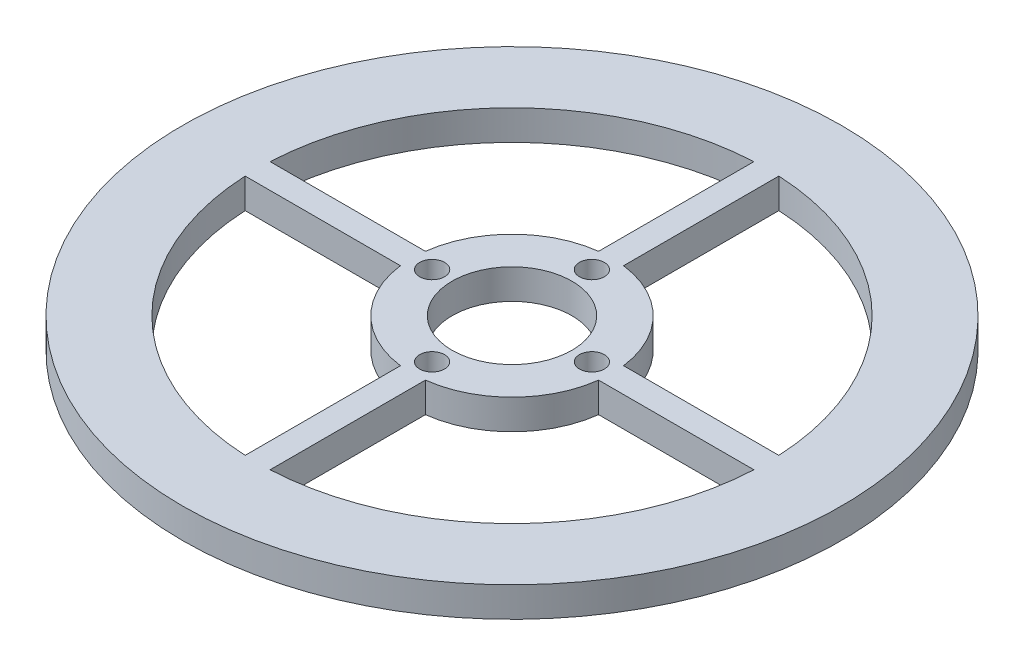
ISO-10303-21;
HEADER;
FILE_DESCRIPTION(('STEP AP214'),'2;1');
FILE_NAME('part.step','',(''),(''),'','','');
FILE_SCHEMA(('AUTOMOTIVE_DESIGN { 1 0 10303 214 1 1 1 1 }'));
ENDSEC;
DATA;
#1=APPLICATION_CONTEXT('core data for automotive mechanical design processes');
#2=APPLICATION_PROTOCOL_DEFINITION('international standard','automotive_design',2000,#1);
#3=PRODUCT_CONTEXT('',#1,'mechanical');
#4=PRODUCT('Part','Part','',(#3));
#5=PRODUCT_RELATED_PRODUCT_CATEGORY('part','',(#4));
#6=PRODUCT_DEFINITION_FORMATION('','',#4);
#7=PRODUCT_DEFINITION_CONTEXT('part definition',#1,'design');
#8=PRODUCT_DEFINITION('design','',#6,#7);
#9=PRODUCT_DEFINITION_SHAPE('','',#8);
#10=(LENGTH_UNIT() NAMED_UNIT(*) SI_UNIT(.MILLI.,.METRE.));
#11=(NAMED_UNIT(*) PLANE_ANGLE_UNIT() SI_UNIT($,.RADIAN.));
#12=(NAMED_UNIT(*) SI_UNIT($,.STERADIAN.) SOLID_ANGLE_UNIT());
#13=UNCERTAINTY_MEASURE_WITH_UNIT(LENGTH_MEASURE(1.E-05),#10,'distance_accuracy_value','');
#14=(GEOMETRIC_REPRESENTATION_CONTEXT(3) GLOBAL_UNCERTAINTY_ASSIGNED_CONTEXT((#13)) GLOBAL_UNIT_ASSIGNED_CONTEXT((#10,
#11,#12)) REPRESENTATION_CONTEXT('',''));
#15=CARTESIAN_POINT('',(0.,0.,0.));
#16=DIRECTION('',(0.,0.,1.));
#17=DIRECTION('',(1.,0.,0.));
#18=AXIS2_PLACEMENT_3D('',#15,#16,#17);
#19=CARTESIAN_POINT('',(-1.25,3.,0.));
#20=DIRECTION('',(1.,0.,0.));
#21=DIRECTION('',(0.,0.,-1.));
#22=AXIS2_PLACEMENT_3D('',#19,#20,#21);
#23=PLANE('',#22);
#24=DIRECTION('',(0.,0.,1.));
#25=VECTOR('',#24,1.);
#26=CARTESIAN_POINT('',(-1.25,0.,0.));
#27=LINE('',#26,#25);
#28=CARTESIAN_POINT('',(-1.25,0.,9.92156741649221));
#29=VERTEX_POINT('',#28);
#30=CARTESIAN_POINT('',(-1.25,0.,25.4693443182191));
#31=VERTEX_POINT('',#30);
#32=EDGE_CURVE('E259',#29,#31,#27,.T.);
#33=ORIENTED_EDGE('',*,*,#32,.T.);
#34=DIRECTION('',(0.,-1.,0.));
#35=VECTOR('',#34,1.);
#36=CARTESIAN_POINT('',(-1.25,3.,25.4693443182191));
#37=LINE('',#36,#35);
#38=CARTESIAN_POINT('',(-1.25,3.,25.4693443182191));
#39=VERTEX_POINT('',#38);
#40=EDGE_CURVE('E11',#39,#31,#37,.T.);
#41=ORIENTED_EDGE('',*,*,#40,.F.);
#42=DIRECTION('',(0.,0.,1.));
#43=VECTOR('',#42,1.);
#44=CARTESIAN_POINT('',(-1.25,3.,0.));
#45=LINE('',#44,#43);
#46=CARTESIAN_POINT('',(-1.25,3.,9.92156741649221));
#47=VERTEX_POINT('',#46);
#48=EDGE_CURVE('E181',#47,#39,#45,.T.);
#49=ORIENTED_EDGE('',*,*,#48,.F.);
#50=DIRECTION('',(0.,-1.,0.));
#51=VECTOR('',#50,1.);
#52=CARTESIAN_POINT('',(-1.25,3.,9.92156741649221));
#53=LINE('',#52,#51);
#54=EDGE_CURVE('E286',#47,#29,#53,.T.);
#55=ORIENTED_EDGE('',*,*,#54,.T.);
#56=EDGE_LOOP('',(#33,#41,#49,#55));
#57=FACE_BOUND('',#56,.T.);
#58=ADVANCED_FACE('F50',(#57),#23,.F.);
#59=CARTESIAN_POINT('',(0.,3.,0.));
#60=DIRECTION('',(0.,-1.,0.));
#61=DIRECTION('',(0.,0.,-1.));
#62=AXIS2_PLACEMENT_3D('',#59,#60,#61);
#63=CYLINDRICAL_SURFACE('',#62,25.5);
#64=CARTESIAN_POINT('',(0.,0.,0.));
#65=DIRECTION('',(0.,1.,0.));
#66=DIRECTION('',(0.,0.,1.));
#67=AXIS2_PLACEMENT_3D('',#64,#65,#66);
#68=CIRCLE('',#67,25.5);
#69=CARTESIAN_POINT('',(-25.4693443182191,0.,1.25));
#70=VERTEX_POINT('',#69);
#71=EDGE_CURVE('E171',#70,#31,#68,.T.);
#72=ORIENTED_EDGE('',*,*,#71,.F.);
#73=DIRECTION('',(0.,-1.,0.));
#74=VECTOR('',#73,1.);
#75=CARTESIAN_POINT('',(-25.4693443182191,3.,1.25));
#76=LINE('',#75,#74);
#77=CARTESIAN_POINT('',(-25.4693443182191,3.,1.25));
#78=VERTEX_POINT('',#77);
#79=EDGE_CURVE('E59',#78,#70,#76,.T.);
#80=ORIENTED_EDGE('',*,*,#79,.F.);
#81=CARTESIAN_POINT('',(0.,3.,0.));
#82=DIRECTION('',(0.,1.,0.));
#83=DIRECTION('',(0.,0.,1.));
#84=AXIS2_PLACEMENT_3D('',#81,#82,#83);
#85=CIRCLE('',#84,25.5);
#86=EDGE_CURVE('E168',#78,#39,#85,.T.);
#87=ORIENTED_EDGE('',*,*,#86,.T.);
#88=ORIENTED_EDGE('',*,*,#40,.T.);
#89=EDGE_LOOP('',(#72,#80,#87,#88));
#90=FACE_BOUND('',#89,.T.);
#91=ADVANCED_FACE('F166',(#90),#63,.F.);
#92=CARTESIAN_POINT('',(0.,3.,1.25));
#93=DIRECTION('',(0.,0.,1.));
#94=DIRECTION('',(1.,0.,0.));
#95=AXIS2_PLACEMENT_3D('',#92,#93,#94);
#96=PLANE('',#95);
#97=DIRECTION('',(-1.,0.,0.));
#98=VECTOR('',#97,1.);
#99=CARTESIAN_POINT('',(0.,0.,1.25));
#100=LINE('',#99,#98);
#101=CARTESIAN_POINT('',(-9.92156741649221,0.,1.25));
#102=VERTEX_POINT('',#101);
#103=EDGE_CURVE('E263',#102,#70,#100,.T.);
#104=ORIENTED_EDGE('',*,*,#103,.F.);
#105=DIRECTION('',(0.,-1.,0.));
#106=VECTOR('',#105,1.);
#107=CARTESIAN_POINT('',(-9.92156741649221,3.,1.25));
#108=LINE('',#107,#106);
#109=CARTESIAN_POINT('',(-9.92156741649221,3.,1.25));
#110=VERTEX_POINT('',#109);
#111=EDGE_CURVE('E120',#110,#102,#108,.T.);
#112=ORIENTED_EDGE('',*,*,#111,.F.);
#113=DIRECTION('',(-1.,0.,0.));
#114=VECTOR('',#113,1.);
#115=CARTESIAN_POINT('',(0.,3.,1.25));
#116=LINE('',#115,#114);
#117=EDGE_CURVE('E182',#110,#78,#116,.T.);
#118=ORIENTED_EDGE('',*,*,#117,.T.);
#119=ORIENTED_EDGE('',*,*,#79,.T.);
#120=EDGE_LOOP('',(#104,#112,#118,#119));
#121=FACE_BOUND('',#120,.T.);
#122=ADVANCED_FACE('F188',(#121),#96,.T.);
#123=CARTESIAN_POINT('',(-1.25,0.,-25.4693443182191));
#124=VERTEX_POINT('',#123);
#125=CARTESIAN_POINT('',(-25.4693443182191,0.,-1.25));
#126=VERTEX_POINT('',#125);
#127=EDGE_CURVE('E250',#124,#126,#68,.T.);
#128=ORIENTED_EDGE('',*,*,#127,.F.);
#129=DIRECTION('',(0.,-1.,0.));
#130=VECTOR('',#129,1.);
#131=CARTESIAN_POINT('',(-1.25,3.,-25.4693443182191));
#132=LINE('',#131,#130);
#133=CARTESIAN_POINT('',(-1.25,3.,-25.4693443182191));
#134=VERTEX_POINT('',#133);
#135=EDGE_CURVE('E291',#134,#124,#132,.T.);
#136=ORIENTED_EDGE('',*,*,#135,.F.);
#137=CARTESIAN_POINT('',(-25.4693443182191,3.,-1.25));
#138=VERTEX_POINT('',#137);
#139=EDGE_CURVE('E186',#134,#138,#85,.T.);
#140=ORIENTED_EDGE('',*,*,#139,.T.);
#141=DIRECTION('',(0.,-1.,0.));
#142=VECTOR('',#141,1.);
#143=CARTESIAN_POINT('',(-25.4693443182191,3.,-1.25));
#144=LINE('',#143,#142);
#145=EDGE_CURVE('E299',#138,#126,#144,.T.);
#146=ORIENTED_EDGE('',*,*,#145,.T.);
#147=EDGE_LOOP('',(#128,#136,#140,#146));
#148=FACE_BOUND('',#147,.T.);
#149=ADVANCED_FACE('F417',(#148),#63,.F.);
#150=CARTESIAN_POINT('',(-1.25,3.,0.));
#151=DIRECTION('',(-1.,0.,0.));
#152=DIRECTION('',(0.,0.,1.));
#153=AXIS2_PLACEMENT_3D('',#150,#151,#152);
#154=PLANE('',#153);
#155=DIRECTION('',(0.,0.,-1.));
#156=VECTOR('',#155,1.);
#157=CARTESIAN_POINT('',(-1.25,0.,0.));
#158=LINE('',#157,#156);
#159=CARTESIAN_POINT('',(-1.25,0.,-9.92156741649221));
#160=VERTEX_POINT('',#159);
#161=EDGE_CURVE('E246',#160,#124,#158,.T.);
#162=ORIENTED_EDGE('',*,*,#161,.F.);
#163=DIRECTION('',(0.,-1.,0.));
#164=VECTOR('',#163,1.);
#165=CARTESIAN_POINT('',(-1.25,3.,-9.92156741649221));
#166=LINE('',#165,#164);
#167=CARTESIAN_POINT('',(-1.25,3.,-9.92156741649221));
#168=VERTEX_POINT('',#167);
#169=EDGE_CURVE('E305',#168,#160,#166,.T.);
#170=ORIENTED_EDGE('',*,*,#169,.F.);
#171=DIRECTION('',(0.,0.,-1.));
#172=VECTOR('',#171,1.);
#173=CARTESIAN_POINT('',(-1.25,3.,0.));
#174=LINE('',#173,#172);
#175=EDGE_CURVE('E368',#168,#134,#174,.T.);
#176=ORIENTED_EDGE('',*,*,#175,.T.);
#177=ORIENTED_EDGE('',*,*,#135,.T.);
#178=EDGE_LOOP('',(#162,#170,#176,#177));
#179=FACE_BOUND('',#178,.T.);
#180=ADVANCED_FACE('F421',(#179),#154,.T.);
#181=CARTESIAN_POINT('',(0.,3.,0.));
#182=DIRECTION('',(0.,-1.,0.));
#183=DIRECTION('',(0.,0.,-1.));
#184=AXIS2_PLACEMENT_3D('',#181,#182,#183);
#185=CYLINDRICAL_SURFACE('',#184,10.);
#186=CARTESIAN_POINT('',(0.,0.,0.));
#187=DIRECTION('',(0.,1.,0.));
#188=DIRECTION('',(0.,0.,1.));
#189=AXIS2_PLACEMENT_3D('',#186,#187,#188);
#190=CIRCLE('',#189,10.);
#191=CARTESIAN_POINT('',(-9.92156741649221,0.,-1.25));
#192=VERTEX_POINT('',#191);
#193=EDGE_CURVE('E255',#160,#192,#190,.T.);
#194=ORIENTED_EDGE('',*,*,#193,.T.);
#195=DIRECTION('',(0.,-1.,0.));
#196=VECTOR('',#195,1.);
#197=CARTESIAN_POINT('',(-9.92156741649221,3.,-1.25));
#198=LINE('',#197,#196);
#199=CARTESIAN_POINT('',(-9.92156741649221,3.,-1.25));
#200=VERTEX_POINT('',#199);
#201=EDGE_CURVE('E298',#200,#192,#198,.T.);
#202=ORIENTED_EDGE('',*,*,#201,.F.);
#203=CARTESIAN_POINT('',(0.,3.,0.));
#204=DIRECTION('',(0.,1.,0.));
#205=DIRECTION('',(0.,0.,1.));
#206=AXIS2_PLACEMENT_3D('',#203,#204,#205);
#207=CIRCLE('',#206,10.);
#208=EDGE_CURVE('E191',#168,#200,#207,.T.);
#209=ORIENTED_EDGE('',*,*,#208,.F.);
#210=ORIENTED_EDGE('',*,*,#169,.T.);
#211=EDGE_LOOP('',(#194,#202,#209,#210));
#212=FACE_BOUND('',#211,.T.);
#213=ADVANCED_FACE('F423',(#212),#185,.T.);
#214=CARTESIAN_POINT('',(25.4693443182191,0.,-1.25));
#215=VERTEX_POINT('',#214);
#216=CARTESIAN_POINT('',(1.25,0.,-25.4693443182191));
#217=VERTEX_POINT('',#216);
#218=EDGE_CURVE('E228',#215,#217,#68,.T.);
#219=ORIENTED_EDGE('',*,*,#218,.F.);
#220=DIRECTION('',(0.,-1.,0.));
#221=VECTOR('',#220,1.);
#222=CARTESIAN_POINT('',(25.4693443182191,3.,-1.25));
#223=LINE('',#222,#221);
#224=CARTESIAN_POINT('',(25.4693443182191,3.,-1.25));
#225=VERTEX_POINT('',#224);
#226=EDGE_CURVE('E297',#225,#215,#223,.T.);
#227=ORIENTED_EDGE('',*,*,#226,.F.);
#228=CARTESIAN_POINT('',(1.25,3.,-25.4693443182191));
#229=VERTEX_POINT('',#228);
#230=EDGE_CURVE('E354',#225,#229,#85,.T.);
#231=ORIENTED_EDGE('',*,*,#230,.T.);
#232=DIRECTION('',(0.,-1.,0.));
#233=VECTOR('',#232,1.);
#234=CARTESIAN_POINT('',(1.25,3.,-25.4693443182191));
#235=LINE('',#234,#233);
#236=EDGE_CURVE('E310',#229,#217,#235,.T.);
#237=ORIENTED_EDGE('',*,*,#236,.T.);
#238=EDGE_LOOP('',(#219,#227,#231,#237));
#239=FACE_BOUND('',#238,.T.);
#240=ADVANCED_FACE('F399',(#239),#63,.F.);
#241=CARTESIAN_POINT('',(0.,3.,-1.25));
#242=DIRECTION('',(0.,0.,-1.));
#243=DIRECTION('',(-1.,0.,0.));
#244=AXIS2_PLACEMENT_3D('',#241,#242,#243);
#245=PLANE('',#244);
#246=DIRECTION('',(1.,0.,0.));
#247=VECTOR('',#246,1.);
#248=CARTESIAN_POINT('',(0.,0.,-1.25));
#249=LINE('',#248,#247);
#250=CARTESIAN_POINT('',(9.92156741649221,0.,-1.25));
#251=VERTEX_POINT('',#250);
#252=EDGE_CURVE('E244',#251,#215,#249,.T.);
#253=ORIENTED_EDGE('',*,*,#252,.F.);
#254=DIRECTION('',(0.,-1.,0.));
#255=VECTOR('',#254,1.);
#256=CARTESIAN_POINT('',(9.92156741649221,3.,-1.25));
#257=LINE('',#256,#255);
#258=CARTESIAN_POINT('',(9.92156741649221,3.,-1.25));
#259=VERTEX_POINT('',#258);
#260=EDGE_CURVE('E316',#259,#251,#257,.T.);
#261=ORIENTED_EDGE('',*,*,#260,.F.);
#262=DIRECTION('',(1.,0.,0.));
#263=VECTOR('',#262,1.);
#264=CARTESIAN_POINT('',(0.,3.,-1.25));
#265=LINE('',#264,#263);
#266=EDGE_CURVE('E358',#259,#225,#265,.T.);
#267=ORIENTED_EDGE('',*,*,#266,.T.);
#268=ORIENTED_EDGE('',*,*,#226,.T.);
#269=EDGE_LOOP('',(#253,#261,#267,#268));
#270=FACE_BOUND('',#269,.T.);
#271=ADVANCED_FACE('F396',(#270),#245,.T.);
#272=CARTESIAN_POINT('',(1.25,0.,-9.92156741649221));
#273=VERTEX_POINT('',#272);
#274=EDGE_CURVE('E240',#251,#273,#190,.T.);
#275=ORIENTED_EDGE('',*,*,#274,.T.);
#276=DIRECTION('',(0.,-1.,0.));
#277=VECTOR('',#276,1.);
#278=CARTESIAN_POINT('',(1.25,3.,-9.92156741649221));
#279=LINE('',#278,#277);
#280=CARTESIAN_POINT('',(1.25,3.,-9.92156741649221));
#281=VERTEX_POINT('',#280);
#282=EDGE_CURVE('E315',#281,#273,#279,.T.);
#283=ORIENTED_EDGE('',*,*,#282,.F.);
#284=EDGE_CURVE('E359',#259,#281,#207,.T.);
#285=ORIENTED_EDGE('',*,*,#284,.F.);
#286=ORIENTED_EDGE('',*,*,#260,.T.);
#287=EDGE_LOOP('',(#275,#283,#285,#286));
#288=FACE_BOUND('',#287,.T.);
#289=ADVANCED_FACE('F388',(#288),#185,.T.);
#290=CARTESIAN_POINT('',(1.25,0.,25.4693443182191));
#291=VERTEX_POINT('',#290);
#292=CARTESIAN_POINT('',(25.4693443182191,0.,1.25));
#293=VERTEX_POINT('',#292);
#294=EDGE_CURVE('E221',#291,#293,#68,.T.);
#295=ORIENTED_EDGE('',*,*,#294,.F.);
#296=DIRECTION('',(0.,-1.,0.));
#297=VECTOR('',#296,1.);
#298=CARTESIAN_POINT('',(1.25,3.,25.4693443182191));
#299=LINE('',#298,#297);
#300=CARTESIAN_POINT('',(1.25,3.,25.4693443182191));
#301=VERTEX_POINT('',#300);
#302=EDGE_CURVE('E51',#301,#291,#299,.T.);
#303=ORIENTED_EDGE('',*,*,#302,.F.);
#304=CARTESIAN_POINT('',(25.4693443182191,3.,1.25));
#305=VERTEX_POINT('',#304);
#306=EDGE_CURVE('E190',#301,#305,#85,.T.);
#307=ORIENTED_EDGE('',*,*,#306,.T.);
#308=DIRECTION('',(0.,-1.,0.));
#309=VECTOR('',#308,1.);
#310=CARTESIAN_POINT('',(25.4693443182191,3.,1.25));
#311=LINE('',#310,#309);
#312=EDGE_CURVE('E224',#305,#293,#311,.T.);
#313=ORIENTED_EDGE('',*,*,#312,.T.);
#314=EDGE_LOOP('',(#295,#303,#307,#313));
#315=FACE_BOUND('',#314,.T.);
#316=ADVANCED_FACE('F336',(#315),#63,.F.);
#317=CARTESIAN_POINT('',(1.25,3.,0.));
#318=DIRECTION('',(1.,0.,0.));
#319=DIRECTION('',(0.,0.,-1.));
#320=AXIS2_PLACEMENT_3D('',#317,#318,#319);
#321=PLANE('',#320);
#322=DIRECTION('',(0.,0.,1.));
#323=VECTOR('',#322,1.);
#324=CARTESIAN_POINT('',(1.25,0.,0.));
#325=LINE('',#324,#323);
#326=CARTESIAN_POINT('',(1.25,0.,9.92156741649221));
#327=VERTEX_POINT('',#326);
#328=EDGE_CURVE('E230',#327,#291,#325,.T.);
#329=ORIENTED_EDGE('',*,*,#328,.F.);
#330=DIRECTION('',(0.,-1.,0.));
#331=VECTOR('',#330,1.);
#332=CARTESIAN_POINT('',(1.25,3.,9.92156741649221));
#333=LINE('',#332,#331);
#334=CARTESIAN_POINT('',(1.25,3.,9.92156741649221));
#335=VERTEX_POINT('',#334);
#336=EDGE_CURVE('E326',#335,#327,#333,.T.);
#337=ORIENTED_EDGE('',*,*,#336,.F.);
#338=DIRECTION('',(0.,0.,1.));
#339=VECTOR('',#338,1.);
#340=CARTESIAN_POINT('',(1.25,3.,0.));
#341=LINE('',#340,#339);
#342=EDGE_CURVE('E339',#335,#301,#341,.T.);
#343=ORIENTED_EDGE('',*,*,#342,.T.);
#344=ORIENTED_EDGE('',*,*,#302,.T.);
#345=EDGE_LOOP('',(#329,#337,#343,#344));
#346=FACE_BOUND('',#345,.T.);
#347=ADVANCED_FACE('F47',(#346),#321,.T.);
#348=CARTESIAN_POINT('',(9.92156741649221,0.,1.25));
#349=VERTEX_POINT('',#348);
#350=EDGE_CURVE('E232',#327,#349,#190,.T.);
#351=ORIENTED_EDGE('',*,*,#350,.T.);
#352=DIRECTION('',(0.,-1.,0.));
#353=VECTOR('',#352,1.);
#354=CARTESIAN_POINT('',(9.92156741649221,3.,1.25));
#355=LINE('',#354,#353);
#356=CARTESIAN_POINT('',(9.92156741649221,3.,1.25));
#357=VERTEX_POINT('',#356);
#358=EDGE_CURVE('E323',#357,#349,#355,.T.);
#359=ORIENTED_EDGE('',*,*,#358,.F.);
#360=EDGE_CURVE('E198',#335,#357,#207,.T.);
#361=ORIENTED_EDGE('',*,*,#360,.F.);
#362=ORIENTED_EDGE('',*,*,#336,.T.);
#363=EDGE_LOOP('',(#351,#359,#361,#362));
#364=FACE_BOUND('',#363,.T.);
#365=ADVANCED_FACE('F345',(#364),#185,.T.);
#366=CARTESIAN_POINT('',(0.,3.,0.));
#367=DIRECTION('',(0.,-1.,0.));
#368=DIRECTION('',(0.,0.,-1.));
#369=AXIS2_PLACEMENT_3D('',#366,#367,#368);
#370=CYLINDRICAL_SURFACE('',#369,6.);
#371=CARTESIAN_POINT('',(0.,3.,0.));
#372=DIRECTION('',(0.,1.,0.));
#373=DIRECTION('',(0.,0.,1.));
#374=AXIS2_PLACEMENT_3D('',#371,#372,#373);
#375=CIRCLE('',#374,6.);
#376=CARTESIAN_POINT('',(0.,3.,6.));
#377=VERTEX_POINT('',#376);
#378=EDGE_CURVE('E214',#377,#377,#375,.T.);
#379=ORIENTED_EDGE('',*,*,#378,.T.);
#380=EDGE_LOOP('',(#379));
#381=FACE_BOUND('',#380,.T.);
#382=CARTESIAN_POINT('',(0.,0.,0.));
#383=DIRECTION('',(0.,1.,0.));
#384=DIRECTION('',(0.,0.,1.));
#385=AXIS2_PLACEMENT_3D('',#382,#383,#384);
#386=CIRCLE('',#385,6.);
#387=CARTESIAN_POINT('',(0.,0.,6.));
#388=VERTEX_POINT('',#387);
#389=EDGE_CURVE('E281',#388,#388,#386,.T.);
#390=ORIENTED_EDGE('',*,*,#389,.F.);
#391=EDGE_LOOP('',(#390));
#392=FACE_BOUND('',#391,.T.);
#393=ADVANCED_FACE('F451',(#381,#392),#370,.F.);
#394=CARTESIAN_POINT('',(0.,3.,-8.));
#395=DIRECTION('',(0.,-1.,0.));
#396=DIRECTION('',(0.,0.,-1.));
#397=AXIS2_PLACEMENT_3D('',#394,#395,#396);
#398=CYLINDRICAL_SURFACE('',#397,1.25);
#399=CARTESIAN_POINT('',(0.,3.,-8.));
#400=DIRECTION('',(0.,1.,0.));
#401=DIRECTION('',(0.,0.,1.));
#402=AXIS2_PLACEMENT_3D('',#399,#400,#401);
#403=CIRCLE('',#402,1.25);
#404=CARTESIAN_POINT('',(0.,3.,-6.75));
#405=VERTEX_POINT('',#404);
#406=EDGE_CURVE('E211',#405,#405,#403,.T.);
#407=ORIENTED_EDGE('',*,*,#406,.T.);
#408=EDGE_LOOP('',(#407));
#409=FACE_BOUND('',#408,.T.);
#410=CARTESIAN_POINT('',(0.,0.,-8.));
#411=DIRECTION('',(0.,1.,0.));
#412=DIRECTION('',(0.,0.,1.));
#413=AXIS2_PLACEMENT_3D('',#410,#411,#412);
#414=CIRCLE('',#413,1.25);
#415=CARTESIAN_POINT('',(0.,0.,-6.75));
#416=VERTEX_POINT('',#415);
#417=EDGE_CURVE('E279',#416,#416,#414,.T.);
#418=ORIENTED_EDGE('',*,*,#417,.F.);
#419=EDGE_LOOP('',(#418));
#420=FACE_BOUND('',#419,.T.);
#421=ADVANCED_FACE('F458',(#409,#420),#398,.F.);
#422=CARTESIAN_POINT('',(-8.,3.,0.));
#423=DIRECTION('',(0.,-1.,0.));
#424=DIRECTION('',(0.,0.,-1.));
#425=AXIS2_PLACEMENT_3D('',#422,#423,#424);
#426=CYLINDRICAL_SURFACE('',#425,1.25);
#427=CARTESIAN_POINT('',(-8.,3.,0.));
#428=DIRECTION('',(0.,1.,0.));
#429=DIRECTION('',(0.,0.,1.));
#430=AXIS2_PLACEMENT_3D('',#427,#428,#429);
#431=CIRCLE('',#430,1.25);
#432=CARTESIAN_POINT('',(-8.,3.,1.24999999999994));
#433=VERTEX_POINT('',#432);
#434=EDGE_CURVE('E210',#433,#433,#431,.T.);
#435=ORIENTED_EDGE('',*,*,#434,.T.);
#436=EDGE_LOOP('',(#435));
#437=FACE_BOUND('',#436,.T.);
#438=CARTESIAN_POINT('',(-8.,0.,0.));
#439=DIRECTION('',(0.,1.,0.));
#440=DIRECTION('',(0.,0.,1.));
#441=AXIS2_PLACEMENT_3D('',#438,#439,#440);
#442=CIRCLE('',#441,1.25);
#443=CARTESIAN_POINT('',(-8.,0.,1.24999999999994));
#444=VERTEX_POINT('',#443);
#445=EDGE_CURVE('E273',#444,#444,#442,.T.);
#446=ORIENTED_EDGE('',*,*,#445,.F.);
#447=EDGE_LOOP('',(#446));
#448=FACE_BOUND('',#447,.T.);
#449=ADVANCED_FACE('F487',(#437,#448),#426,.F.);
#450=CARTESIAN_POINT('',(0.,3.,8.));
#451=DIRECTION('',(0.,-1.,0.));
#452=DIRECTION('',(0.,0.,-1.));
#453=AXIS2_PLACEMENT_3D('',#450,#451,#452);
#454=CYLINDRICAL_SURFACE('',#453,1.25);
#455=CARTESIAN_POINT('',(0.,3.,8.));
#456=DIRECTION('',(0.,1.,0.));
#457=DIRECTION('',(0.,0.,1.));
#458=AXIS2_PLACEMENT_3D('',#455,#456,#457);
#459=CIRCLE('',#458,1.25);
#460=CARTESIAN_POINT('',(0.,3.,9.25));
#461=VERTEX_POINT('',#460);
#462=EDGE_CURVE('E201',#461,#461,#459,.T.);
#463=ORIENTED_EDGE('',*,*,#462,.T.);
#464=EDGE_LOOP('',(#463));
#465=FACE_BOUND('',#464,.T.);
#466=CARTESIAN_POINT('',(0.,0.,8.));
#467=DIRECTION('',(0.,1.,0.));
#468=DIRECTION('',(0.,0.,1.));
#469=AXIS2_PLACEMENT_3D('',#466,#467,#468);
#470=CIRCLE('',#469,1.25);
#471=CARTESIAN_POINT('',(0.,0.,9.25));
#472=VERTEX_POINT('',#471);
#473=EDGE_CURVE('E269',#472,#472,#470,.T.);
#474=ORIENTED_EDGE('',*,*,#473,.F.);
#475=EDGE_LOOP('',(#474));
#476=FACE_BOUND('',#475,.T.);
#477=ADVANCED_FACE('F453',(#465,#476),#454,.F.);
#478=CARTESIAN_POINT('',(8.,3.,0.));
#479=DIRECTION('',(0.,-1.,0.));
#480=DIRECTION('',(0.,0.,-1.));
#481=AXIS2_PLACEMENT_3D('',#478,#479,#480);
#482=CYLINDRICAL_SURFACE('',#481,1.25);
#483=CARTESIAN_POINT('',(8.,3.,0.));
#484=DIRECTION('',(0.,1.,0.));
#485=DIRECTION('',(0.,0.,1.));
#486=AXIS2_PLACEMENT_3D('',#483,#484,#485);
#487=CIRCLE('',#486,1.25);
#488=CARTESIAN_POINT('',(8.,3.,1.25));
#489=VERTEX_POINT('',#488);
#490=EDGE_CURVE('E192',#489,#489,#487,.T.);
#491=ORIENTED_EDGE('',*,*,#490,.T.);
#492=EDGE_LOOP('',(#491));
#493=FACE_BOUND('',#492,.T.);
#494=CARTESIAN_POINT('',(8.,0.,0.));
#495=DIRECTION('',(0.,1.,0.));
#496=DIRECTION('',(0.,0.,1.));
#497=AXIS2_PLACEMENT_3D('',#494,#495,#496);
#498=CIRCLE('',#497,1.25);
#499=CARTESIAN_POINT('',(8.,0.,1.25));
#500=VERTEX_POINT('',#499);
#501=EDGE_CURVE('E266',#500,#500,#498,.T.);
#502=ORIENTED_EDGE('',*,*,#501,.F.);
#503=EDGE_LOOP('',(#502));
#504=FACE_BOUND('',#503,.T.);
#505=ADVANCED_FACE('F446',(#493,#504),#482,.F.);
#506=EDGE_CURVE('E123',#102,#29,#190,.T.);
#507=ORIENTED_EDGE('',*,*,#506,.T.);
#508=ORIENTED_EDGE('',*,*,#54,.F.);
#509=EDGE_CURVE('E69',#110,#47,#207,.T.);
#510=ORIENTED_EDGE('',*,*,#509,.F.);
#511=ORIENTED_EDGE('',*,*,#111,.T.);
#512=EDGE_LOOP('',(#507,#508,#510,#511));
#513=FACE_BOUND('',#512,.T.);
#514=ADVANCED_FACE('F431',(#513),#185,.T.);
#515=CARTESIAN_POINT('',(0.,3.,-1.25));
#516=DIRECTION('',(0.,0.,1.));
#517=DIRECTION('',(1.,0.,0.));
#518=AXIS2_PLACEMENT_3D('',#515,#516,#517);
#519=PLANE('',#518);
#520=DIRECTION('',(-1.,0.,0.));
#521=VECTOR('',#520,1.);
#522=CARTESIAN_POINT('',(0.,0.,-1.25));
#523=LINE('',#522,#521);
#524=EDGE_CURVE('E254',#192,#126,#523,.T.);
#525=ORIENTED_EDGE('',*,*,#524,.T.);
#526=ORIENTED_EDGE('',*,*,#145,.F.);
#527=DIRECTION('',(-1.,0.,0.));
#528=VECTOR('',#527,1.);
#529=CARTESIAN_POINT('',(0.,3.,-1.25));
#530=LINE('',#529,#528);
#531=EDGE_CURVE('E369',#200,#138,#530,.T.);
#532=ORIENTED_EDGE('',*,*,#531,.F.);
#533=ORIENTED_EDGE('',*,*,#201,.T.);
#534=EDGE_LOOP('',(#525,#526,#532,#533));
#535=FACE_BOUND('',#534,.T.);
#536=ADVANCED_FACE('F419',(#535),#519,.F.);
#537=CARTESIAN_POINT('',(1.25,3.,0.));
#538=DIRECTION('',(-1.,0.,0.));
#539=DIRECTION('',(0.,0.,1.));
#540=AXIS2_PLACEMENT_3D('',#537,#538,#539);
#541=PLANE('',#540);
#542=DIRECTION('',(0.,0.,-1.));
#543=VECTOR('',#542,1.);
#544=CARTESIAN_POINT('',(1.25,0.,0.));
#545=LINE('',#544,#543);
#546=EDGE_CURVE('E242',#273,#217,#545,.T.);
#547=ORIENTED_EDGE('',*,*,#546,.T.);
#548=ORIENTED_EDGE('',*,*,#236,.F.);
#549=DIRECTION('',(0.,0.,-1.));
#550=VECTOR('',#549,1.);
#551=CARTESIAN_POINT('',(1.25,3.,0.));
#552=LINE('',#551,#550);
#553=EDGE_CURVE('E361',#281,#229,#552,.T.);
#554=ORIENTED_EDGE('',*,*,#553,.F.);
#555=ORIENTED_EDGE('',*,*,#282,.T.);
#556=EDGE_LOOP('',(#547,#548,#554,#555));
#557=FACE_BOUND('',#556,.T.);
#558=ADVANCED_FACE('F395',(#557),#541,.F.);
#559=CARTESIAN_POINT('',(0.,3.,1.25));
#560=DIRECTION('',(0.,0.,-1.));
#561=DIRECTION('',(-1.,0.,0.));
#562=AXIS2_PLACEMENT_3D('',#559,#560,#561);
#563=PLANE('',#562);
#564=DIRECTION('',(1.,0.,0.));
#565=VECTOR('',#564,1.);
#566=CARTESIAN_POINT('',(0.,0.,1.25));
#567=LINE('',#566,#565);
#568=EDGE_CURVE('E237',#349,#293,#567,.T.);
#569=ORIENTED_EDGE('',*,*,#568,.T.);
#570=ORIENTED_EDGE('',*,*,#312,.F.);
#571=DIRECTION('',(1.,0.,0.));
#572=VECTOR('',#571,1.);
#573=CARTESIAN_POINT('',(0.,3.,1.25));
#574=LINE('',#573,#572);
#575=EDGE_CURVE('E346',#357,#305,#574,.T.);
#576=ORIENTED_EDGE('',*,*,#575,.F.);
#577=ORIENTED_EDGE('',*,*,#358,.T.);
#578=EDGE_LOOP('',(#569,#570,#576,#577));
#579=FACE_BOUND('',#578,.T.);
#580=ADVANCED_FACE('F350',(#579),#563,.F.);
#581=CARTESIAN_POINT('',(0.,3.,0.));
#582=DIRECTION('',(0.,-1.,0.));
#583=DIRECTION('',(0.,0.,-1.));
#584=AXIS2_PLACEMENT_3D('',#581,#582,#583);
#585=CYLINDRICAL_SURFACE('',#584,33.);
#586=CARTESIAN_POINT('',(0.,3.,0.));
#587=DIRECTION('',(0.,1.,0.));
#588=DIRECTION('',(0.,0.,1.));
#589=AXIS2_PLACEMENT_3D('',#586,#587,#588);
#590=CIRCLE('',#589,33.);
#591=CARTESIAN_POINT('',(0.,3.,33.));
#592=VERTEX_POINT('',#591);
#593=EDGE_CURVE('E218',#592,#592,#590,.T.);
#594=ORIENTED_EDGE('',*,*,#593,.F.);
#595=EDGE_LOOP('',(#594));
#596=FACE_BOUND('',#595,.T.);
#597=CARTESIAN_POINT('',(0.,0.,0.));
#598=DIRECTION('',(0.,1.,0.));
#599=DIRECTION('',(0.,0.,1.));
#600=AXIS2_PLACEMENT_3D('',#597,#598,#599);
#601=CIRCLE('',#600,33.);
#602=CARTESIAN_POINT('',(0.,0.,33.));
#603=VERTEX_POINT('',#602);
#604=EDGE_CURVE('E288',#603,#603,#601,.T.);
#605=ORIENTED_EDGE('',*,*,#604,.T.);
#606=EDGE_LOOP('',(#605));
#607=FACE_BOUND('',#606,.T.);
#608=ADVANCED_FACE('F471',(#596,#607),#585,.T.);
#609=CARTESIAN_POINT('',(0.,3.,0.));
#610=DIRECTION('',(0.,1.,0.));
#611=DIRECTION('',(0.,0.,1.));
#612=AXIS2_PLACEMENT_3D('',#609,#610,#611);
#613=PLANE('',#612);
#614=ORIENTED_EDGE('',*,*,#306,.F.);
#615=ORIENTED_EDGE('',*,*,#342,.F.);
#616=ORIENTED_EDGE('',*,*,#360,.T.);
#617=ORIENTED_EDGE('',*,*,#575,.T.);
#618=EDGE_LOOP('',(#614,#615,#616,#617));
#619=FACE_BOUND('',#618,.T.);
#620=ORIENTED_EDGE('',*,*,#230,.F.);
#621=ORIENTED_EDGE('',*,*,#266,.F.);
#622=ORIENTED_EDGE('',*,*,#284,.T.);
#623=ORIENTED_EDGE('',*,*,#553,.T.);
#624=EDGE_LOOP('',(#620,#621,#622,#623));
#625=FACE_BOUND('',#624,.T.);
#626=ORIENTED_EDGE('',*,*,#139,.F.);
#627=ORIENTED_EDGE('',*,*,#175,.F.);
#628=ORIENTED_EDGE('',*,*,#208,.T.);
#629=ORIENTED_EDGE('',*,*,#531,.T.);
#630=EDGE_LOOP('',(#626,#627,#628,#629));
#631=FACE_BOUND('',#630,.T.);
#632=ORIENTED_EDGE('',*,*,#48,.T.);
#633=ORIENTED_EDGE('',*,*,#86,.F.);
#634=ORIENTED_EDGE('',*,*,#117,.F.);
#635=ORIENTED_EDGE('',*,*,#509,.T.);
#636=EDGE_LOOP('',(#632,#633,#634,#635));
#637=FACE_BOUND('',#636,.T.);
#638=ORIENTED_EDGE('',*,*,#490,.F.);
#639=EDGE_LOOP('',(#638));
#640=FACE_BOUND('',#639,.T.);
#641=ORIENTED_EDGE('',*,*,#462,.F.);
#642=EDGE_LOOP('',(#641));
#643=FACE_BOUND('',#642,.T.);
#644=ORIENTED_EDGE('',*,*,#434,.F.);
#645=EDGE_LOOP('',(#644));
#646=FACE_BOUND('',#645,.T.);
#647=ORIENTED_EDGE('',*,*,#406,.F.);
#648=EDGE_LOOP('',(#647));
#649=FACE_BOUND('',#648,.T.);
#650=ORIENTED_EDGE('',*,*,#378,.F.);
#651=EDGE_LOOP('',(#650));
#652=FACE_BOUND('',#651,.T.);
#653=ORIENTED_EDGE('',*,*,#593,.T.);
#654=EDGE_LOOP('',(#653));
#655=FACE_BOUND('',#654,.T.);
#656=ADVANCED_FACE('F180',(#619,#625,#631,#637,#640,#643,#646,#649,#652,#655),#613,.T.);
#657=CARTESIAN_POINT('',(0.,0.,0.));
#658=DIRECTION('',(0.,1.,0.));
#659=DIRECTION('',(0.,0.,1.));
#660=AXIS2_PLACEMENT_3D('',#657,#658,#659);
#661=PLANE('',#660);
#662=ORIENTED_EDGE('',*,*,#294,.T.);
#663=ORIENTED_EDGE('',*,*,#568,.F.);
#664=ORIENTED_EDGE('',*,*,#350,.F.);
#665=ORIENTED_EDGE('',*,*,#328,.T.);
#666=EDGE_LOOP('',(#662,#663,#664,#665));
#667=FACE_BOUND('',#666,.T.);
#668=ORIENTED_EDGE('',*,*,#218,.T.);
#669=ORIENTED_EDGE('',*,*,#546,.F.);
#670=ORIENTED_EDGE('',*,*,#274,.F.);
#671=ORIENTED_EDGE('',*,*,#252,.T.);
#672=EDGE_LOOP('',(#668,#669,#670,#671));
#673=FACE_BOUND('',#672,.T.);
#674=ORIENTED_EDGE('',*,*,#127,.T.);
#675=ORIENTED_EDGE('',*,*,#524,.F.);
#676=ORIENTED_EDGE('',*,*,#193,.F.);
#677=ORIENTED_EDGE('',*,*,#161,.T.);
#678=EDGE_LOOP('',(#674,#675,#676,#677));
#679=FACE_BOUND('',#678,.T.);
#680=ORIENTED_EDGE('',*,*,#32,.F.);
#681=ORIENTED_EDGE('',*,*,#506,.F.);
#682=ORIENTED_EDGE('',*,*,#103,.T.);
#683=ORIENTED_EDGE('',*,*,#71,.T.);
#684=EDGE_LOOP('',(#680,#681,#682,#683));
#685=FACE_BOUND('',#684,.T.);
#686=ORIENTED_EDGE('',*,*,#501,.T.);
#687=EDGE_LOOP('',(#686));
#688=FACE_BOUND('',#687,.T.);
#689=ORIENTED_EDGE('',*,*,#473,.T.);
#690=EDGE_LOOP('',(#689));
#691=FACE_BOUND('',#690,.T.);
#692=ORIENTED_EDGE('',*,*,#445,.T.);
#693=EDGE_LOOP('',(#692));
#694=FACE_BOUND('',#693,.T.);
#695=ORIENTED_EDGE('',*,*,#417,.T.);
#696=EDGE_LOOP('',(#695));
#697=FACE_BOUND('',#696,.T.);
#698=ORIENTED_EDGE('',*,*,#389,.T.);
#699=EDGE_LOOP('',(#698));
#700=FACE_BOUND('',#699,.T.);
#701=ORIENTED_EDGE('',*,*,#604,.F.);
#702=EDGE_LOOP('',(#701));
#703=FACE_BOUND('',#702,.T.);
#704=ADVANCED_FACE('F343',(#667,#673,#679,#685,#688,#691,#694,#697,#700,#703),#661,.F.);
#705=CLOSED_SHELL('',(#58,#91,#122,#149,#180,#213,#240,#271,#289,#316,#347,#365,#393,#421,#449,
#477,#505,#514,#536,#558,#580,#608,#656,#704));
#706=MANIFOLD_SOLID_BREP('B2',#705);
#707=ADVANCED_BREP_SHAPE_REPRESENTATION('',(#18,#706),#14);
#708=SHAPE_DEFINITION_REPRESENTATION(#9,#707);
ENDSEC;
END-ISO-10303-21;
